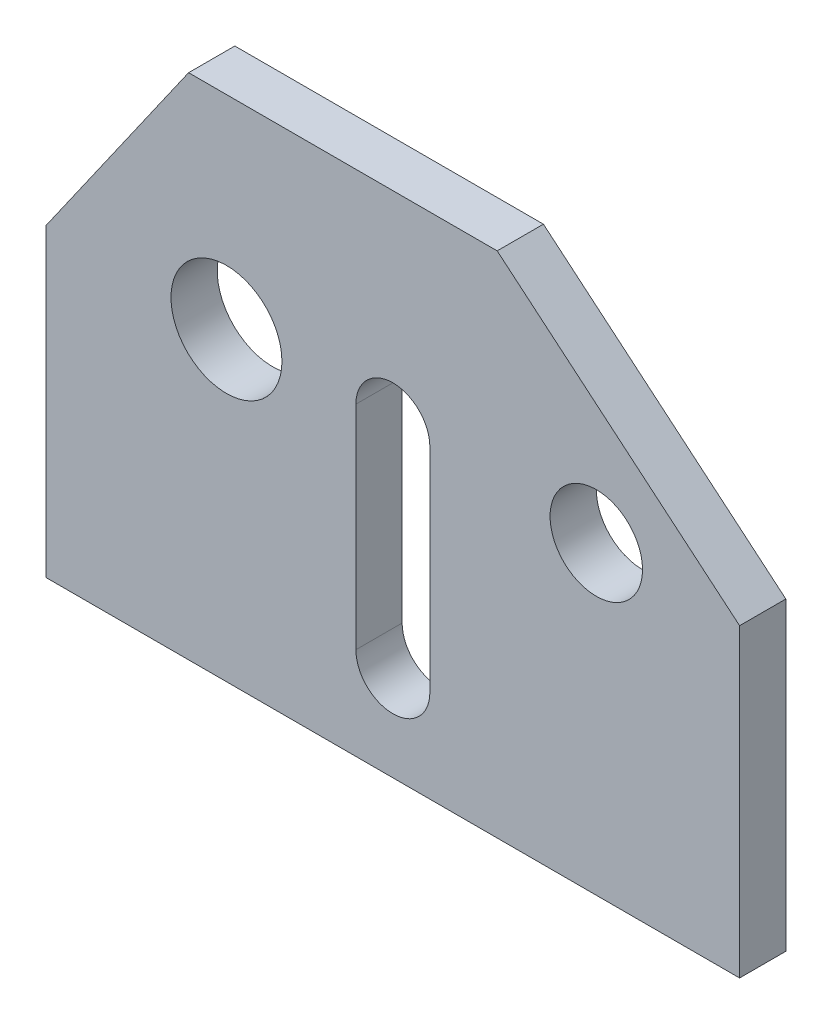
ISO-10303-21;
HEADER;
FILE_DESCRIPTION(('STEP AP214'),'2;1');
FILE_NAME('part.step','',(''),(''),'','','');
FILE_SCHEMA(('AUTOMOTIVE_DESIGN { 1 0 10303 214 1 1 1 1 }'));
ENDSEC;
DATA;
#1=APPLICATION_CONTEXT('core data for automotive mechanical design processes');
#2=APPLICATION_PROTOCOL_DEFINITION('international standard','automotive_design',2000,#1);
#3=PRODUCT_CONTEXT('',#1,'mechanical');
#4=PRODUCT('Part','Part','',(#3));
#5=PRODUCT_RELATED_PRODUCT_CATEGORY('part','',(#4));
#6=PRODUCT_DEFINITION_FORMATION('','',#4);
#7=PRODUCT_DEFINITION_CONTEXT('part definition',#1,'design');
#8=PRODUCT_DEFINITION('design','',#6,#7);
#9=PRODUCT_DEFINITION_SHAPE('','',#8);
#10=(LENGTH_UNIT() NAMED_UNIT(*) SI_UNIT(.MILLI.,.METRE.));
#11=(NAMED_UNIT(*) PLANE_ANGLE_UNIT() SI_UNIT($,.RADIAN.));
#12=(NAMED_UNIT(*) SI_UNIT($,.STERADIAN.) SOLID_ANGLE_UNIT());
#13=UNCERTAINTY_MEASURE_WITH_UNIT(LENGTH_MEASURE(1.E-05),#10,'distance_accuracy_value','');
#14=(GEOMETRIC_REPRESENTATION_CONTEXT(3) GLOBAL_UNCERTAINTY_ASSIGNED_CONTEXT((#13)) GLOBAL_UNIT_ASSIGNED_CONTEXT((#10,
#11,#12)) REPRESENTATION_CONTEXT('',''));
#15=CARTESIAN_POINT('',(0.,0.,0.));
#16=DIRECTION('',(0.,0.,1.));
#17=DIRECTION('',(1.,0.,0.));
#18=AXIS2_PLACEMENT_3D('',#15,#16,#17);
#19=CARTESIAN_POINT('',(0.,0.,5.));
#20=DIRECTION('',(0.,0.,1.));
#21=DIRECTION('',(1.,0.,0.));
#22=AXIS2_PLACEMENT_3D('',#19,#20,#21);
#23=PLANE('',#22);
#24=CARTESIAN_POINT('',(19.5,33.,5.));
#25=DIRECTION('',(0.,0.,1.));
#26=DIRECTION('',(1.,0.,0.));
#27=AXIS2_PLACEMENT_3D('',#24,#25,#26);
#28=CIRCLE('',#27,6.);
#29=CARTESIAN_POINT('',(25.5,33.,5.));
#30=VERTEX_POINT('',#29);
#31=EDGE_CURVE('E177',#30,#30,#28,.T.);
#32=ORIENTED_EDGE('',*,*,#31,.F.);
#33=EDGE_LOOP('',(#32));
#34=FACE_BOUND('',#33,.T.);
#35=DIRECTION('',(0.,-1.,0.));
#36=VECTOR('',#35,1.);
#37=CARTESIAN_POINT('',(0.,33.,5.));
#38=LINE('',#37,#36);
#39=CARTESIAN_POINT('',(0.,33.,5.));
#40=VERTEX_POINT('',#39);
#41=CARTESIAN_POINT('',(0.,0.,5.));
#42=VERTEX_POINT('',#41);
#43=EDGE_CURVE('E185',#40,#42,#38,.T.);
#44=ORIENTED_EDGE('',*,*,#43,.T.);
#45=DIRECTION('',(1.,0.,0.));
#46=VECTOR('',#45,1.);
#47=CARTESIAN_POINT('',(0.,0.,5.));
#48=LINE('',#47,#46);
#49=CARTESIAN_POINT('',(75.,0.,5.));
#50=VERTEX_POINT('',#49);
#51=EDGE_CURVE('E189',#42,#50,#48,.T.);
#52=ORIENTED_EDGE('',*,*,#51,.T.);
#53=DIRECTION('',(0.,1.,0.));
#54=VECTOR('',#53,1.);
#55=CARTESIAN_POINT('',(75.,0.,5.));
#56=LINE('',#55,#54);
#57=CARTESIAN_POINT('',(75.,33.,5.));
#58=VERTEX_POINT('',#57);
#59=EDGE_CURVE('E193',#50,#58,#56,.T.);
#60=ORIENTED_EDGE('',*,*,#59,.T.);
#61=DIRECTION('',(-0.766044443118979,0.642787609686538,0.));
#62=VECTOR('',#61,1.);
#63=CARTESIAN_POINT('',(75.,33.,5.));
#64=LINE('',#63,#62);
#65=CARTESIAN_POINT('',(48.7814209629273,55.,5.));
#66=VERTEX_POINT('',#65);
#67=EDGE_CURVE('E196',#58,#66,#64,.T.);
#68=ORIENTED_EDGE('',*,*,#67,.T.);
#69=DIRECTION('',(-1.,0.,0.));
#70=VECTOR('',#69,1.);
#71=CARTESIAN_POINT('',(48.7814209629273,55.,5.));
#72=LINE('',#71,#70);
#73=CARTESIAN_POINT('',(15.4045658406137,55.,5.));
#74=VERTEX_POINT('',#73);
#75=EDGE_CURVE('E199',#66,#74,#72,.T.);
#76=ORIENTED_EDGE('',*,*,#75,.T.);
#77=DIRECTION('',(-0.573576436351047,-0.819152044288991,0.));
#78=VECTOR('',#77,1.);
#79=CARTESIAN_POINT('',(15.4045658406137,55.,5.));
#80=LINE('',#79,#78);
#81=EDGE_CURVE('E202',#74,#40,#80,.T.);
#82=ORIENTED_EDGE('',*,*,#81,.T.);
#83=EDGE_LOOP('',(#44,#52,#60,#68,#76,#82));
#84=FACE_BOUND('',#83,.T.);
#85=CARTESIAN_POINT('',(59.5,33.,5.));
#86=DIRECTION('',(0.,0.,1.));
#87=DIRECTION('',(1.,0.,0.));
#88=AXIS2_PLACEMENT_3D('',#85,#86,#87);
#89=CIRCLE('',#88,4.99999999999999);
#90=CARTESIAN_POINT('',(64.5,33.,5.));
#91=VERTEX_POINT('',#90);
#92=EDGE_CURVE('E169',#91,#91,#89,.T.);
#93=ORIENTED_EDGE('',*,*,#92,.F.);
#94=EDGE_LOOP('',(#93));
#95=FACE_BOUND('',#94,.T.);
#96=DIRECTION('',(0.,-1.,0.));
#97=VECTOR('',#96,1.);
#98=CARTESIAN_POINT('',(33.5,33.,5.));
#99=LINE('',#98,#97);
#100=CARTESIAN_POINT('',(33.5,33.,5.));
#101=VERTEX_POINT('',#100);
#102=CARTESIAN_POINT('',(33.5,10.,5.));
#103=VERTEX_POINT('',#102);
#104=EDGE_CURVE('E130',#101,#103,#99,.T.);
#105=ORIENTED_EDGE('',*,*,#104,.F.);
#106=CARTESIAN_POINT('',(37.5,33.,5.));
#107=DIRECTION('',(0.,0.,1.));
#108=DIRECTION('',(-1.,0.,0.));
#109=AXIS2_PLACEMENT_3D('',#106,#107,#108);
#110=CIRCLE('',#109,4.);
#111=CARTESIAN_POINT('',(41.5,33.,5.));
#112=VERTEX_POINT('',#111);
#113=EDGE_CURVE('E121',#112,#101,#110,.T.);
#114=ORIENTED_EDGE('',*,*,#113,.F.);
#115=DIRECTION('',(0.,1.,0.));
#116=VECTOR('',#115,1.);
#117=CARTESIAN_POINT('',(41.5,33.,5.));
#118=LINE('',#117,#116);
#119=CARTESIAN_POINT('',(41.5,10.,5.));
#120=VERTEX_POINT('',#119);
#121=EDGE_CURVE('E147',#120,#112,#118,.T.);
#122=ORIENTED_EDGE('',*,*,#121,.F.);
#123=CARTESIAN_POINT('',(37.5,10.,5.));
#124=DIRECTION('',(0.,0.,1.));
#125=DIRECTION('',(1.,0.,0.));
#126=AXIS2_PLACEMENT_3D('',#123,#124,#125);
#127=CIRCLE('',#126,4.);
#128=EDGE_CURVE('E143',#103,#120,#127,.T.);
#129=ORIENTED_EDGE('',*,*,#128,.F.);
#130=EDGE_LOOP('',(#105,#114,#122,#129));
#131=FACE_BOUND('',#130,.T.);
#132=ADVANCED_FACE('F43',(#34,#84,#95,#131),#23,.T.);
#133=CARTESIAN_POINT('',(0.,0.,0.));
#134=DIRECTION('',(0.,0.,1.));
#135=DIRECTION('',(1.,0.,0.));
#136=AXIS2_PLACEMENT_3D('',#133,#134,#135);
#137=PLANE('',#136);
#138=CARTESIAN_POINT('',(59.5,33.,0.));
#139=DIRECTION('',(0.,0.,1.));
#140=DIRECTION('',(1.,0.,0.));
#141=AXIS2_PLACEMENT_3D('',#138,#139,#140);
#142=CIRCLE('',#141,4.99999999999999);
#143=CARTESIAN_POINT('',(64.5,33.,0.));
#144=VERTEX_POINT('',#143);
#145=EDGE_CURVE('E139',#144,#144,#142,.T.);
#146=ORIENTED_EDGE('',*,*,#145,.T.);
#147=EDGE_LOOP('',(#146));
#148=FACE_BOUND('',#147,.T.);
#149=CARTESIAN_POINT('',(19.5,33.,0.));
#150=DIRECTION('',(0.,0.,1.));
#151=DIRECTION('',(1.,0.,0.));
#152=AXIS2_PLACEMENT_3D('',#149,#150,#151);
#153=CIRCLE('',#152,6.);
#154=CARTESIAN_POINT('',(25.5,33.,0.));
#155=VERTEX_POINT('',#154);
#156=EDGE_CURVE('E173',#155,#155,#153,.T.);
#157=ORIENTED_EDGE('',*,*,#156,.T.);
#158=EDGE_LOOP('',(#157));
#159=FACE_BOUND('',#158,.T.);
#160=DIRECTION('',(0.,-1.,0.));
#161=VECTOR('',#160,1.);
#162=CARTESIAN_POINT('',(0.,33.,0.));
#163=LINE('',#162,#161);
#164=CARTESIAN_POINT('',(0.,33.,0.));
#165=VERTEX_POINT('',#164);
#166=CARTESIAN_POINT('',(0.,0.,0.));
#167=VERTEX_POINT('',#166);
#168=EDGE_CURVE('E181',#165,#167,#163,.T.);
#169=ORIENTED_EDGE('',*,*,#168,.F.);
#170=DIRECTION('',(-0.573576436351047,-0.819152044288991,0.));
#171=VECTOR('',#170,1.);
#172=CARTESIAN_POINT('',(15.4045658406137,55.,0.));
#173=LINE('',#172,#171);
#174=CARTESIAN_POINT('',(15.4045658406137,55.,0.));
#175=VERTEX_POINT('',#174);
#176=EDGE_CURVE('E190',#175,#165,#173,.T.);
#177=ORIENTED_EDGE('',*,*,#176,.F.);
#178=DIRECTION('',(-1.,0.,0.));
#179=VECTOR('',#178,1.);
#180=CARTESIAN_POINT('',(48.7814209629273,55.,0.));
#181=LINE('',#180,#179);
#182=CARTESIAN_POINT('',(48.7814209629273,55.,0.));
#183=VERTEX_POINT('',#182);
#184=EDGE_CURVE('E218',#183,#175,#181,.T.);
#185=ORIENTED_EDGE('',*,*,#184,.F.);
#186=DIRECTION('',(-0.766044443118979,0.642787609686538,0.));
#187=VECTOR('',#186,1.);
#188=CARTESIAN_POINT('',(75.,33.,0.));
#189=LINE('',#188,#187);
#190=CARTESIAN_POINT('',(75.,33.,0.));
#191=VERTEX_POINT('',#190);
#192=EDGE_CURVE('E215',#191,#183,#189,.T.);
#193=ORIENTED_EDGE('',*,*,#192,.F.);
#194=DIRECTION('',(0.,1.,0.));
#195=VECTOR('',#194,1.);
#196=CARTESIAN_POINT('',(75.,0.,0.));
#197=LINE('',#196,#195);
#198=CARTESIAN_POINT('',(75.,0.,0.));
#199=VERTEX_POINT('',#198);
#200=EDGE_CURVE('E212',#199,#191,#197,.T.);
#201=ORIENTED_EDGE('',*,*,#200,.F.);
#202=DIRECTION('',(1.,0.,0.));
#203=VECTOR('',#202,1.);
#204=CARTESIAN_POINT('',(0.,0.,0.));
#205=LINE('',#204,#203);
#206=EDGE_CURVE('E209',#167,#199,#205,.T.);
#207=ORIENTED_EDGE('',*,*,#206,.F.);
#208=EDGE_LOOP('',(#169,#177,#185,#193,#201,#207));
#209=FACE_BOUND('',#208,.T.);
#210=CARTESIAN_POINT('',(37.5,33.,0.));
#211=DIRECTION('',(0.,0.,1.));
#212=DIRECTION('',(-1.,0.,0.));
#213=AXIS2_PLACEMENT_3D('',#210,#211,#212);
#214=CIRCLE('',#213,4.);
#215=CARTESIAN_POINT('',(41.5,33.,0.));
#216=VERTEX_POINT('',#215);
#217=CARTESIAN_POINT('',(33.5,33.,0.));
#218=VERTEX_POINT('',#217);
#219=EDGE_CURVE('E67',#216,#218,#214,.T.);
#220=ORIENTED_EDGE('',*,*,#219,.T.);
#221=DIRECTION('',(0.,-1.,0.));
#222=VECTOR('',#221,1.);
#223=CARTESIAN_POINT('',(33.5,33.,0.));
#224=LINE('',#223,#222);
#225=CARTESIAN_POINT('',(33.5,10.,0.));
#226=VERTEX_POINT('',#225);
#227=EDGE_CURVE('E137',#218,#226,#224,.T.);
#228=ORIENTED_EDGE('',*,*,#227,.T.);
#229=CARTESIAN_POINT('',(37.5,10.,0.));
#230=DIRECTION('',(0.,0.,1.));
#231=DIRECTION('',(1.,0.,0.));
#232=AXIS2_PLACEMENT_3D('',#229,#230,#231);
#233=CIRCLE('',#232,4.);
#234=CARTESIAN_POINT('',(41.5,10.,0.));
#235=VERTEX_POINT('',#234);
#236=EDGE_CURVE('E156',#226,#235,#233,.T.);
#237=ORIENTED_EDGE('',*,*,#236,.T.);
#238=DIRECTION('',(0.,1.,0.));
#239=VECTOR('',#238,1.);
#240=CARTESIAN_POINT('',(41.5,33.,0.));
#241=LINE('',#240,#239);
#242=EDGE_CURVE('E131',#235,#216,#241,.T.);
#243=ORIENTED_EDGE('',*,*,#242,.T.);
#244=EDGE_LOOP('',(#220,#228,#237,#243));
#245=FACE_BOUND('',#244,.T.);
#246=ADVANCED_FACE('F249',(#148,#159,#209,#245),#137,.F.);
#247=CARTESIAN_POINT('',(0.,33.,5.));
#248=DIRECTION('',(1.,0.,0.));
#249=DIRECTION('',(0.,1.,0.));
#250=AXIS2_PLACEMENT_3D('',#247,#248,#249);
#251=PLANE('',#250);
#252=ORIENTED_EDGE('',*,*,#168,.T.);
#253=DIRECTION('',(0.,0.,-1.));
#254=VECTOR('',#253,1.);
#255=CARTESIAN_POINT('',(0.,0.,5.));
#256=LINE('',#255,#254);
#257=EDGE_CURVE('E11',#42,#167,#256,.T.);
#258=ORIENTED_EDGE('',*,*,#257,.F.);
#259=ORIENTED_EDGE('',*,*,#43,.F.);
#260=DIRECTION('',(0.,0.,-1.));
#261=VECTOR('',#260,1.);
#262=CARTESIAN_POINT('',(0.,33.,5.));
#263=LINE('',#262,#261);
#264=EDGE_CURVE('E205',#40,#165,#263,.T.);
#265=ORIENTED_EDGE('',*,*,#264,.T.);
#266=EDGE_LOOP('',(#252,#258,#259,#265));
#267=FACE_BOUND('',#266,.T.);
#268=ADVANCED_FACE('F45',(#267),#251,.F.);
#269=CARTESIAN_POINT('',(0.,0.,5.));
#270=DIRECTION('',(0.,1.,0.));
#271=DIRECTION('',(0.,0.,1.));
#272=AXIS2_PLACEMENT_3D('',#269,#270,#271);
#273=PLANE('',#272);
#274=ORIENTED_EDGE('',*,*,#206,.T.);
#275=DIRECTION('',(0.,0.,-1.));
#276=VECTOR('',#275,1.);
#277=CARTESIAN_POINT('',(75.,0.,5.));
#278=LINE('',#277,#276);
#279=EDGE_CURVE('E52',#50,#199,#278,.T.);
#280=ORIENTED_EDGE('',*,*,#279,.F.);
#281=ORIENTED_EDGE('',*,*,#51,.F.);
#282=ORIENTED_EDGE('',*,*,#257,.T.);
#283=EDGE_LOOP('',(#274,#280,#281,#282));
#284=FACE_BOUND('',#283,.T.);
#285=ADVANCED_FACE('F267',(#284),#273,.F.);
#286=CARTESIAN_POINT('',(75.,0.,5.));
#287=DIRECTION('',(-1.,0.,0.));
#288=DIRECTION('',(0.,0.,1.));
#289=AXIS2_PLACEMENT_3D('',#286,#287,#288);
#290=PLANE('',#289);
#291=ORIENTED_EDGE('',*,*,#200,.T.);
#292=DIRECTION('',(0.,0.,-1.));
#293=VECTOR('',#292,1.);
#294=CARTESIAN_POINT('',(75.,33.,5.));
#295=LINE('',#294,#293);
#296=EDGE_CURVE('E234',#58,#191,#295,.T.);
#297=ORIENTED_EDGE('',*,*,#296,.F.);
#298=ORIENTED_EDGE('',*,*,#59,.F.);
#299=ORIENTED_EDGE('',*,*,#279,.T.);
#300=EDGE_LOOP('',(#291,#297,#298,#299));
#301=FACE_BOUND('',#300,.T.);
#302=ADVANCED_FACE('F243',(#301),#290,.F.);
#303=CARTESIAN_POINT('',(75.,33.,5.));
#304=DIRECTION('',(-0.642787609686538,-0.766044443118979,0.));
#305=DIRECTION('',(0.766044443118979,-0.642787609686538,0.));
#306=AXIS2_PLACEMENT_3D('',#303,#304,#305);
#307=PLANE('',#306);
#308=ORIENTED_EDGE('',*,*,#192,.T.);
#309=DIRECTION('',(0.,0.,-1.));
#310=VECTOR('',#309,1.);
#311=CARTESIAN_POINT('',(48.7814209629273,55.,5.));
#312=LINE('',#311,#310);
#313=EDGE_CURVE('E230',#66,#183,#312,.T.);
#314=ORIENTED_EDGE('',*,*,#313,.F.);
#315=ORIENTED_EDGE('',*,*,#67,.F.);
#316=ORIENTED_EDGE('',*,*,#296,.T.);
#317=EDGE_LOOP('',(#308,#314,#315,#316));
#318=FACE_BOUND('',#317,.T.);
#319=ADVANCED_FACE('F255',(#318),#307,.F.);
#320=CARTESIAN_POINT('',(48.7814209629273,55.,5.));
#321=DIRECTION('',(0.,-1.,0.));
#322=DIRECTION('',(1.,0.,0.));
#323=AXIS2_PLACEMENT_3D('',#320,#321,#322);
#324=PLANE('',#323);
#325=ORIENTED_EDGE('',*,*,#184,.T.);
#326=DIRECTION('',(0.,0.,-1.));
#327=VECTOR('',#326,1.);
#328=CARTESIAN_POINT('',(15.4045658406137,55.,5.));
#329=LINE('',#328,#327);
#330=EDGE_CURVE('E226',#74,#175,#329,.T.);
#331=ORIENTED_EDGE('',*,*,#330,.F.);
#332=ORIENTED_EDGE('',*,*,#75,.F.);
#333=ORIENTED_EDGE('',*,*,#313,.T.);
#334=EDGE_LOOP('',(#325,#331,#332,#333));
#335=FACE_BOUND('',#334,.T.);
#336=ADVANCED_FACE('F259',(#335),#324,.F.);
#337=CARTESIAN_POINT('',(15.4045658406137,55.,5.));
#338=DIRECTION('',(0.819152044288991,-0.573576436351047,0.));
#339=DIRECTION('',(0.573576436351047,0.819152044288991,0.));
#340=AXIS2_PLACEMENT_3D('',#337,#338,#339);
#341=PLANE('',#340);
#342=ORIENTED_EDGE('',*,*,#176,.T.);
#343=ORIENTED_EDGE('',*,*,#264,.F.);
#344=ORIENTED_EDGE('',*,*,#81,.F.);
#345=ORIENTED_EDGE('',*,*,#330,.T.);
#346=EDGE_LOOP('',(#342,#343,#344,#345));
#347=FACE_BOUND('',#346,.T.);
#348=ADVANCED_FACE('F270',(#347),#341,.F.);
#349=CARTESIAN_POINT('',(19.5,33.,5.));
#350=DIRECTION('',(0.,0.,-1.));
#351=DIRECTION('',(-1.,0.,0.));
#352=AXIS2_PLACEMENT_3D('',#349,#350,#351);
#353=CYLINDRICAL_SURFACE('',#352,6.);
#354=ORIENTED_EDGE('',*,*,#31,.T.);
#355=EDGE_LOOP('',(#354));
#356=FACE_BOUND('',#355,.T.);
#357=ORIENTED_EDGE('',*,*,#156,.F.);
#358=EDGE_LOOP('',(#357));
#359=FACE_BOUND('',#358,.T.);
#360=ADVANCED_FACE('F272',(#356,#359),#353,.F.);
#361=CARTESIAN_POINT('',(59.5,33.,5.));
#362=DIRECTION('',(0.,0.,-1.));
#363=DIRECTION('',(-1.,0.,0.));
#364=AXIS2_PLACEMENT_3D('',#361,#362,#363);
#365=CYLINDRICAL_SURFACE('',#364,4.99999999999999);
#366=ORIENTED_EDGE('',*,*,#92,.T.);
#367=EDGE_LOOP('',(#366));
#368=FACE_BOUND('',#367,.T.);
#369=ORIENTED_EDGE('',*,*,#145,.F.);
#370=EDGE_LOOP('',(#369));
#371=FACE_BOUND('',#370,.T.);
#372=ADVANCED_FACE('F278',(#368,#371),#365,.F.);
#373=CARTESIAN_POINT('',(37.5,33.,5.));
#374=DIRECTION('',(0.,0.,-1.));
#375=DIRECTION('',(-1.,0.,0.));
#376=AXIS2_PLACEMENT_3D('',#373,#374,#375);
#377=CYLINDRICAL_SURFACE('',#376,4.);
#378=ORIENTED_EDGE('',*,*,#219,.F.);
#379=DIRECTION('',(0.,0.,-1.));
#380=VECTOR('',#379,1.);
#381=CARTESIAN_POINT('',(41.5,33.,5.));
#382=LINE('',#381,#380);
#383=EDGE_CURVE('E125',#112,#216,#382,.T.);
#384=ORIENTED_EDGE('',*,*,#383,.F.);
#385=ORIENTED_EDGE('',*,*,#113,.T.);
#386=DIRECTION('',(0.,0.,-1.));
#387=VECTOR('',#386,1.);
#388=CARTESIAN_POINT('',(33.5,33.,5.));
#389=LINE('',#388,#387);
#390=EDGE_CURVE('E124',#101,#218,#389,.T.);
#391=ORIENTED_EDGE('',*,*,#390,.T.);
#392=EDGE_LOOP('',(#378,#384,#385,#391));
#393=FACE_BOUND('',#392,.T.);
#394=ADVANCED_FACE('F123',(#393),#377,.F.);
#395=CARTESIAN_POINT('',(33.5,33.,5.));
#396=DIRECTION('',(1.,0.,0.));
#397=DIRECTION('',(0.,0.,-1.));
#398=AXIS2_PLACEMENT_3D('',#395,#396,#397);
#399=PLANE('',#398);
#400=ORIENTED_EDGE('',*,*,#227,.F.);
#401=ORIENTED_EDGE('',*,*,#390,.F.);
#402=ORIENTED_EDGE('',*,*,#104,.T.);
#403=DIRECTION('',(0.,0.,-1.));
#404=VECTOR('',#403,1.);
#405=CARTESIAN_POINT('',(33.5,10.,5.));
#406=LINE('',#405,#404);
#407=EDGE_CURVE('E140',#103,#226,#406,.T.);
#408=ORIENTED_EDGE('',*,*,#407,.T.);
#409=EDGE_LOOP('',(#400,#401,#402,#408));
#410=FACE_BOUND('',#409,.T.);
#411=ADVANCED_FACE('F134',(#410),#399,.T.);
#412=CARTESIAN_POINT('',(37.5,10.,5.));
#413=DIRECTION('',(0.,0.,-1.));
#414=DIRECTION('',(-1.,0.,0.));
#415=AXIS2_PLACEMENT_3D('',#412,#413,#414);
#416=CYLINDRICAL_SURFACE('',#415,4.);
#417=ORIENTED_EDGE('',*,*,#236,.F.);
#418=ORIENTED_EDGE('',*,*,#407,.F.);
#419=ORIENTED_EDGE('',*,*,#128,.T.);
#420=DIRECTION('',(0.,0.,-1.));
#421=VECTOR('',#420,1.);
#422=CARTESIAN_POINT('',(41.5,10.,5.));
#423=LINE('',#422,#421);
#424=EDGE_CURVE('E59',#120,#235,#423,.T.);
#425=ORIENTED_EDGE('',*,*,#424,.T.);
#426=EDGE_LOOP('',(#417,#418,#419,#425));
#427=FACE_BOUND('',#426,.T.);
#428=ADVANCED_FACE('F299',(#427),#416,.F.);
#429=CARTESIAN_POINT('',(41.5,33.,5.));
#430=DIRECTION('',(-1.,0.,0.));
#431=DIRECTION('',(0.,0.,1.));
#432=AXIS2_PLACEMENT_3D('',#429,#430,#431);
#433=PLANE('',#432);
#434=ORIENTED_EDGE('',*,*,#242,.F.);
#435=ORIENTED_EDGE('',*,*,#424,.F.);
#436=ORIENTED_EDGE('',*,*,#121,.T.);
#437=ORIENTED_EDGE('',*,*,#383,.T.);
#438=EDGE_LOOP('',(#434,#435,#436,#437));
#439=FACE_BOUND('',#438,.T.);
#440=ADVANCED_FACE('F302',(#439),#433,.T.);
#441=CLOSED_SHELL('',(#132,#246,#268,#285,#302,#319,#336,#348,#360,#372,#394,#411,#428,#440));
#442=MANIFOLD_SOLID_BREP('B2',#441);
#443=ADVANCED_BREP_SHAPE_REPRESENTATION('',(#18,#442),#14);
#444=SHAPE_DEFINITION_REPRESENTATION(#9,#443);
ENDSEC;
END-ISO-10303-21;
